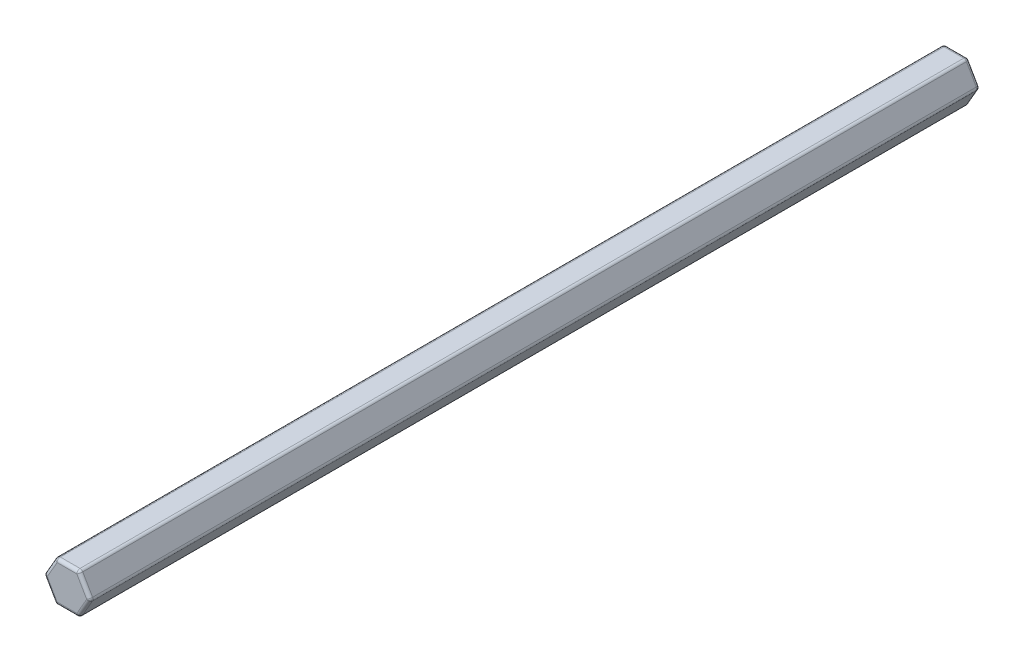
ISO-10303-21;
HEADER;
FILE_DESCRIPTION(('STEP AP214'),'2;1');
FILE_NAME('part.step','',(''),(''),'','','');
FILE_SCHEMA(('AUTOMOTIVE_DESIGN { 1 0 10303 214 1 1 1 1 }'));
ENDSEC;
DATA;
#1=APPLICATION_CONTEXT('core data for automotive mechanical design processes');
#2=APPLICATION_PROTOCOL_DEFINITION('international standard','automotive_design',2000,#1);
#3=PRODUCT_CONTEXT('',#1,'mechanical');
#4=PRODUCT('Part','Part','',(#3));
#5=PRODUCT_RELATED_PRODUCT_CATEGORY('part','',(#4));
#6=PRODUCT_DEFINITION_FORMATION('','',#4);
#7=PRODUCT_DEFINITION_CONTEXT('part definition',#1,'design');
#8=PRODUCT_DEFINITION('design','',#6,#7);
#9=PRODUCT_DEFINITION_SHAPE('','',#8);
#10=(LENGTH_UNIT() NAMED_UNIT(*) SI_UNIT(.MILLI.,.METRE.));
#11=(NAMED_UNIT(*) PLANE_ANGLE_UNIT() SI_UNIT($,.RADIAN.));
#12=(NAMED_UNIT(*) SI_UNIT($,.STERADIAN.) SOLID_ANGLE_UNIT());
#13=UNCERTAINTY_MEASURE_WITH_UNIT(LENGTH_MEASURE(1.E-05),#10,'distance_accuracy_value','');
#14=(GEOMETRIC_REPRESENTATION_CONTEXT(3) GLOBAL_UNCERTAINTY_ASSIGNED_CONTEXT((#13)) GLOBAL_UNIT_ASSIGNED_CONTEXT((#10,
#11,#12)) REPRESENTATION_CONTEXT('',''));
#15=CARTESIAN_POINT('',(0.,0.,0.));
#16=DIRECTION('',(0.,0.,1.));
#17=DIRECTION('',(1.,0.,0.));
#18=AXIS2_PLACEMENT_3D('',#15,#16,#17);
#19=CARTESIAN_POINT('',(3.66617420935412,-6.35,139.7));
#20=DIRECTION('',(-0.866025403784439,0.5,0.));
#21=DIRECTION('',(-0.5,-0.866025403784439,0.));
#22=AXIS2_PLACEMENT_3D('',#19,#20,#21);
#23=PLANE('',#22);
#24=DIRECTION('',(0.5,0.866025403784439,0.));
#25=VECTOR('',#24,1.);
#26=CARTESIAN_POINT('',(3.66617420935412,-6.35,138.7));
#27=LINE('',#26,#25);
#28=CARTESIAN_POINT('',(7.04367328411343,-0.5,138.7));
#29=VERTEX_POINT('',#28);
#30=CARTESIAN_POINT('',(3.95484934394893,-5.85,138.7));
#31=VERTEX_POINT('',#30);
#32=EDGE_CURVE('E281',#29,#31,#27,.F.);
#33=ORIENTED_EDGE('',*,*,#32,.T.);
#34=DIRECTION('',(0.,0.,-1.));
#35=VECTOR('',#34,1.);
#36=CARTESIAN_POINT('',(3.95484934394893,-5.85,139.7));
#37=LINE('',#36,#35);
#38=CARTESIAN_POINT('',(3.95484934394893,-5.85,-138.7));
#39=VERTEX_POINT('',#38);
#40=EDGE_CURVE('E288',#31,#39,#37,.T.);
#41=ORIENTED_EDGE('',*,*,#40,.T.);
#42=DIRECTION('',(0.5,0.866025403784439,0.));
#43=VECTOR('',#42,1.);
#44=CARTESIAN_POINT('',(3.66617420935412,-6.35,-138.7));
#45=LINE('',#44,#43);
#46=CARTESIAN_POINT('',(7.04367328411343,-0.5,-138.7));
#47=VERTEX_POINT('',#46);
#48=EDGE_CURVE('E284',#39,#47,#45,.T.);
#49=ORIENTED_EDGE('',*,*,#48,.T.);
#50=DIRECTION('',(0.,0.,-1.));
#51=VECTOR('',#50,1.);
#52=CARTESIAN_POINT('',(7.04367328411343,-0.500000000000001,139.7));
#53=LINE('',#52,#51);
#54=EDGE_CURVE('E278',#47,#29,#53,.F.);
#55=ORIENTED_EDGE('',*,*,#54,.T.);
#56=EDGE_LOOP('',(#33,#41,#49,#55));
#57=FACE_BOUND('',#56,.T.);
#58=ADVANCED_FACE('F39',(#57),#23,.F.);
#59=CARTESIAN_POINT('',(7.33234841870824,0.,139.7));
#60=DIRECTION('',(-0.866025403784439,-0.5,0.));
#61=DIRECTION('',(0.5,-0.866025403784439,0.));
#62=AXIS2_PLACEMENT_3D('',#59,#60,#61);
#63=PLANE('',#62);
#64=DIRECTION('',(-0.5,0.866025403784439,0.));
#65=VECTOR('',#64,1.);
#66=CARTESIAN_POINT('',(7.33234841870824,0.,138.7));
#67=LINE('',#66,#65);
#68=CARTESIAN_POINT('',(3.95484934394893,5.85,138.7));
#69=VERTEX_POINT('',#68);
#70=CARTESIAN_POINT('',(7.04367328411343,0.5,138.7));
#71=VERTEX_POINT('',#70);
#72=EDGE_CURVE('E196',#69,#71,#67,.F.);
#73=ORIENTED_EDGE('',*,*,#72,.T.);
#74=DIRECTION('',(0.,0.,-1.));
#75=VECTOR('',#74,1.);
#76=CARTESIAN_POINT('',(7.04367328411343,0.5,139.7));
#77=LINE('',#76,#75);
#78=CARTESIAN_POINT('',(7.04367328411343,0.5,-138.7));
#79=VERTEX_POINT('',#78);
#80=EDGE_CURVE('E200',#71,#79,#77,.T.);
#81=ORIENTED_EDGE('',*,*,#80,.T.);
#82=DIRECTION('',(-0.5,0.866025403784439,0.));
#83=VECTOR('',#82,1.);
#84=CARTESIAN_POINT('',(7.33234841870824,0.,-138.7));
#85=LINE('',#84,#83);
#86=CARTESIAN_POINT('',(3.95484934394893,5.85,-138.7));
#87=VERTEX_POINT('',#86);
#88=EDGE_CURVE('E169',#79,#87,#85,.T.);
#89=ORIENTED_EDGE('',*,*,#88,.T.);
#90=DIRECTION('',(0.,0.,-1.));
#91=VECTOR('',#90,1.);
#92=CARTESIAN_POINT('',(3.95484934394893,5.85,139.7));
#93=LINE('',#92,#91);
#94=EDGE_CURVE('E189',#87,#69,#93,.F.);
#95=ORIENTED_EDGE('',*,*,#94,.T.);
#96=EDGE_LOOP('',(#73,#81,#89,#95));
#97=FACE_BOUND('',#96,.T.);
#98=ADVANCED_FACE('F198',(#97),#63,.F.);
#99=CARTESIAN_POINT('',(3.66617420935412,6.35,139.7));
#100=DIRECTION('',(0.,-1.,0.));
#101=DIRECTION('',(1.,0.,0.));
#102=AXIS2_PLACEMENT_3D('',#99,#100,#101);
#103=PLANE('',#102);
#104=DIRECTION('',(-1.,0.,0.));
#105=VECTOR('',#104,1.);
#106=CARTESIAN_POINT('',(3.66617420935412,6.35,-138.7));
#107=LINE('',#106,#105);
#108=CARTESIAN_POINT('',(3.08882394016449,6.35,-138.7));
#109=VERTEX_POINT('',#108);
#110=CARTESIAN_POINT('',(-3.0888239401645,6.35,-138.7));
#111=VERTEX_POINT('',#110);
#112=EDGE_CURVE('E232',#109,#111,#107,.T.);
#113=ORIENTED_EDGE('',*,*,#112,.T.);
#114=DIRECTION('',(0.,0.,-1.));
#115=VECTOR('',#114,1.);
#116=CARTESIAN_POINT('',(-3.0888239401645,6.35,139.7));
#117=LINE('',#116,#115);
#118=CARTESIAN_POINT('',(-3.0888239401645,6.35,138.7));
#119=VERTEX_POINT('',#118);
#120=EDGE_CURVE('E236',#111,#119,#117,.F.);
#121=ORIENTED_EDGE('',*,*,#120,.T.);
#122=DIRECTION('',(-1.,0.,0.));
#123=VECTOR('',#122,1.);
#124=CARTESIAN_POINT('',(3.66617420935412,6.35,138.7));
#125=LINE('',#124,#123);
#126=CARTESIAN_POINT('',(3.08882394016449,6.35,138.7));
#127=VERTEX_POINT('',#126);
#128=EDGE_CURVE('E229',#119,#127,#125,.F.);
#129=ORIENTED_EDGE('',*,*,#128,.T.);
#130=DIRECTION('',(0.,0.,-1.));
#131=VECTOR('',#130,1.);
#132=CARTESIAN_POINT('',(3.08882394016449,6.35,139.7));
#133=LINE('',#132,#131);
#134=EDGE_CURVE('E226',#127,#109,#133,.T.);
#135=ORIENTED_EDGE('',*,*,#134,.T.);
#136=EDGE_LOOP('',(#113,#121,#129,#135));
#137=FACE_BOUND('',#136,.T.);
#138=ADVANCED_FACE('F487',(#137),#103,.F.);
#139=CARTESIAN_POINT('',(-3.66617420935412,6.35,139.7));
#140=DIRECTION('',(0.866025403784439,-0.5,0.));
#141=DIRECTION('',(0.5,0.866025403784439,0.));
#142=AXIS2_PLACEMENT_3D('',#139,#140,#141);
#143=PLANE('',#142);
#144=DIRECTION('',(-0.5,-0.866025403784439,0.));
#145=VECTOR('',#144,1.);
#146=CARTESIAN_POINT('',(-3.66617420935412,6.35,-138.7));
#147=LINE('',#146,#145);
#148=CARTESIAN_POINT('',(-3.95484934394893,5.85,-138.7));
#149=VERTEX_POINT('',#148);
#150=CARTESIAN_POINT('',(-7.04367328411343,0.500000000000001,-138.7));
#151=VERTEX_POINT('',#150);
#152=EDGE_CURVE('E245',#149,#151,#147,.T.);
#153=ORIENTED_EDGE('',*,*,#152,.T.);
#154=DIRECTION('',(0.,0.,-1.));
#155=VECTOR('',#154,1.);
#156=CARTESIAN_POINT('',(-7.04367328411343,0.500000000000002,139.7));
#157=LINE('',#156,#155);
#158=CARTESIAN_POINT('',(-7.04367328411343,0.500000000000001,138.7));
#159=VERTEX_POINT('',#158);
#160=EDGE_CURVE('E249',#151,#159,#157,.F.);
#161=ORIENTED_EDGE('',*,*,#160,.T.);
#162=DIRECTION('',(-0.5,-0.866025403784439,0.));
#163=VECTOR('',#162,1.);
#164=CARTESIAN_POINT('',(-3.66617420935412,6.35,138.7));
#165=LINE('',#164,#163);
#166=CARTESIAN_POINT('',(-3.95484934394893,5.85,138.7));
#167=VERTEX_POINT('',#166);
#168=EDGE_CURVE('E242',#159,#167,#165,.F.);
#169=ORIENTED_EDGE('',*,*,#168,.T.);
#170=DIRECTION('',(0.,0.,-1.));
#171=VECTOR('',#170,1.);
#172=CARTESIAN_POINT('',(-3.95484934394893,5.85,139.7));
#173=LINE('',#172,#171);
#174=EDGE_CURVE('E239',#167,#149,#173,.T.);
#175=ORIENTED_EDGE('',*,*,#174,.T.);
#176=EDGE_LOOP('',(#153,#161,#169,#175));
#177=FACE_BOUND('',#176,.T.);
#178=ADVANCED_FACE('F775',(#177),#143,.F.);
#179=CARTESIAN_POINT('',(-7.33234841870825,0.,139.7));
#180=DIRECTION('',(0.866025403784439,0.5,0.));
#181=DIRECTION('',(-0.5,0.866025403784439,0.));
#182=AXIS2_PLACEMENT_3D('',#179,#180,#181);
#183=PLANE('',#182);
#184=DIRECTION('',(0.5,-0.866025403784439,0.));
#185=VECTOR('',#184,1.);
#186=CARTESIAN_POINT('',(-7.33234841870825,0.,-138.7));
#187=LINE('',#186,#185);
#188=CARTESIAN_POINT('',(-7.04367328411343,-0.499999999999999,-138.7));
#189=VERTEX_POINT('',#188);
#190=CARTESIAN_POINT('',(-3.95484934394894,-5.85,-138.7));
#191=VERTEX_POINT('',#190);
#192=EDGE_CURVE('E258',#189,#191,#187,.T.);
#193=ORIENTED_EDGE('',*,*,#192,.T.);
#194=DIRECTION('',(0.,0.,-1.));
#195=VECTOR('',#194,1.);
#196=CARTESIAN_POINT('',(-3.95484934394894,-5.85,139.7));
#197=LINE('',#196,#195);
#198=CARTESIAN_POINT('',(-3.95484934394894,-5.85,138.7));
#199=VERTEX_POINT('',#198);
#200=EDGE_CURVE('E262',#191,#199,#197,.F.);
#201=ORIENTED_EDGE('',*,*,#200,.T.);
#202=DIRECTION('',(0.5,-0.866025403784439,0.));
#203=VECTOR('',#202,1.);
#204=CARTESIAN_POINT('',(-7.33234841870825,0.,138.7));
#205=LINE('',#204,#203);
#206=CARTESIAN_POINT('',(-7.04367328411343,-0.499999999999999,138.7));
#207=VERTEX_POINT('',#206);
#208=EDGE_CURVE('E255',#199,#207,#205,.F.);
#209=ORIENTED_EDGE('',*,*,#208,.T.);
#210=DIRECTION('',(0.,0.,-1.));
#211=VECTOR('',#210,1.);
#212=CARTESIAN_POINT('',(-7.04367328411343,-0.499999999999999,139.7));
#213=LINE('',#212,#211);
#214=EDGE_CURVE('E252',#207,#189,#213,.T.);
#215=ORIENTED_EDGE('',*,*,#214,.T.);
#216=EDGE_LOOP('',(#193,#201,#209,#215));
#217=FACE_BOUND('',#216,.T.);
#218=ADVANCED_FACE('F767',(#217),#183,.F.);
#219=CARTESIAN_POINT('',(-3.66617420935412,-6.35,139.7));
#220=DIRECTION('',(0.,1.,0.));
#221=DIRECTION('',(-1.,0.,0.));
#222=AXIS2_PLACEMENT_3D('',#219,#220,#221);
#223=PLANE('',#222);
#224=DIRECTION('',(1.,0.,0.));
#225=VECTOR('',#224,1.);
#226=CARTESIAN_POINT('',(-3.66617420935412,-6.35,-138.7));
#227=LINE('',#226,#225);
#228=CARTESIAN_POINT('',(-3.0888239401645,-6.35,-138.7));
#229=VERTEX_POINT('',#228);
#230=CARTESIAN_POINT('',(3.08882394016449,-6.35,-138.7));
#231=VERTEX_POINT('',#230);
#232=EDGE_CURVE('E271',#229,#231,#227,.T.);
#233=ORIENTED_EDGE('',*,*,#232,.T.);
#234=DIRECTION('',(0.,0.,-1.));
#235=VECTOR('',#234,1.);
#236=CARTESIAN_POINT('',(3.08882394016449,-6.35,139.7));
#237=LINE('',#236,#235);
#238=CARTESIAN_POINT('',(3.08882394016449,-6.35,138.7));
#239=VERTEX_POINT('',#238);
#240=EDGE_CURVE('E275',#231,#239,#237,.F.);
#241=ORIENTED_EDGE('',*,*,#240,.T.);
#242=DIRECTION('',(1.,0.,0.));
#243=VECTOR('',#242,1.);
#244=CARTESIAN_POINT('',(-3.66617420935412,-6.35,138.7));
#245=LINE('',#244,#243);
#246=CARTESIAN_POINT('',(-3.0888239401645,-6.35,138.7));
#247=VERTEX_POINT('',#246);
#248=EDGE_CURVE('E268',#239,#247,#245,.F.);
#249=ORIENTED_EDGE('',*,*,#248,.T.);
#250=DIRECTION('',(0.,0.,-1.));
#251=VECTOR('',#250,1.);
#252=CARTESIAN_POINT('',(-3.0888239401645,-6.35,139.7));
#253=LINE('',#252,#251);
#254=EDGE_CURVE('E265',#247,#229,#253,.T.);
#255=ORIENTED_EDGE('',*,*,#254,.T.);
#256=EDGE_LOOP('',(#233,#241,#249,#255));
#257=FACE_BOUND('',#256,.T.);
#258=ADVANCED_FACE('F442',(#257),#223,.F.);
#259=CARTESIAN_POINT('',(0.,0.,139.7));
#260=DIRECTION('',(0.,0.,1.));
#261=DIRECTION('',(1.,0.,0.));
#262=AXIS2_PLACEMENT_3D('',#259,#260,#261);
#263=PLANE('',#262);
#264=DIRECTION('',(0.5,-0.866025403784439,0.));
#265=VECTOR('',#264,1.);
#266=CARTESIAN_POINT('',(-2.80014880556968,-5.85,139.7));
#267=LINE('',#266,#265);
#268=CARTESIAN_POINT('',(-6.17764788032899,0.,139.7));
#269=VERTEX_POINT('',#268);
#270=CARTESIAN_POINT('',(-3.0888239401645,-5.35,139.7));
#271=VERTEX_POINT('',#270);
#272=EDGE_CURVE('E49',#269,#271,#267,.T.);
#273=ORIENTED_EDGE('',*,*,#272,.T.);
#274=DIRECTION('',(1.,0.,0.));
#275=VECTOR('',#274,1.);
#276=CARTESIAN_POINT('',(3.66617420935412,-5.35,139.7));
#277=LINE('',#276,#275);
#278=CARTESIAN_POINT('',(3.08882394016449,-5.35,139.7));
#279=VERTEX_POINT('',#278);
#280=EDGE_CURVE('E11',#271,#279,#277,.T.);
#281=ORIENTED_EDGE('',*,*,#280,.T.);
#282=DIRECTION('',(0.5,0.866025403784439,0.));
#283=VECTOR('',#282,1.);
#284=CARTESIAN_POINT('',(6.4663230149238,0.5,139.7));
#285=LINE('',#284,#283);
#286=CARTESIAN_POINT('',(6.17764788032899,0.,139.7));
#287=VERTEX_POINT('',#286);
#288=EDGE_CURVE('E291',#279,#287,#285,.T.);
#289=ORIENTED_EDGE('',*,*,#288,.T.);
#290=DIRECTION('',(-0.5,0.866025403784439,0.));
#291=VECTOR('',#290,1.);
#292=CARTESIAN_POINT('',(2.80014880556968,5.85,139.7));
#293=LINE('',#292,#291);
#294=CARTESIAN_POINT('',(3.08882394016449,5.35,139.7));
#295=VERTEX_POINT('',#294);
#296=EDGE_CURVE('E294',#287,#295,#293,.T.);
#297=ORIENTED_EDGE('',*,*,#296,.T.);
#298=DIRECTION('',(-1.,0.,0.));
#299=VECTOR('',#298,1.);
#300=CARTESIAN_POINT('',(-3.66617420935412,5.35,139.7));
#301=LINE('',#300,#299);
#302=CARTESIAN_POINT('',(-3.08882394016449,5.35,139.7));
#303=VERTEX_POINT('',#302);
#304=EDGE_CURVE('E297',#295,#303,#301,.T.);
#305=ORIENTED_EDGE('',*,*,#304,.T.);
#306=DIRECTION('',(-0.5,-0.866025403784439,0.));
#307=VECTOR('',#306,1.);
#308=CARTESIAN_POINT('',(-6.46632301492381,-0.499999999999999,139.7));
#309=LINE('',#308,#307);
#310=EDGE_CURVE('E60',#303,#269,#309,.T.);
#311=ORIENTED_EDGE('',*,*,#310,.T.);
#312=EDGE_LOOP('',(#273,#281,#289,#297,#305,#311));
#313=FACE_BOUND('',#312,.T.);
#314=ADVANCED_FACE('F449',(#313),#263,.T.);
#315=CARTESIAN_POINT('',(0.,0.,-139.7));
#316=DIRECTION('',(0.,0.,1.));
#317=DIRECTION('',(1.,0.,0.));
#318=AXIS2_PLACEMENT_3D('',#315,#316,#317);
#319=PLANE('',#318);
#320=DIRECTION('',(-1.,0.,0.));
#321=VECTOR('',#320,1.);
#322=CARTESIAN_POINT('',(0.,5.35,-139.7));
#323=LINE('',#322,#321);
#324=CARTESIAN_POINT('',(-3.0888239401645,5.35,-139.7));
#325=VERTEX_POINT('',#324);
#326=CARTESIAN_POINT('',(3.08882394016449,5.35,-139.7));
#327=VERTEX_POINT('',#326);
#328=EDGE_CURVE('E221',#325,#327,#323,.F.);
#329=ORIENTED_EDGE('',*,*,#328,.T.);
#330=DIRECTION('',(-0.5,0.866025403784439,0.));
#331=VECTOR('',#330,1.);
#332=CARTESIAN_POINT('',(4.63323591024674,2.675,-139.7));
#333=LINE('',#332,#331);
#334=CARTESIAN_POINT('',(6.17764788032899,0.,-139.7));
#335=VERTEX_POINT('',#334);
#336=EDGE_CURVE('E171',#327,#335,#333,.F.);
#337=ORIENTED_EDGE('',*,*,#336,.T.);
#338=DIRECTION('',(0.5,0.866025403784439,0.));
#339=VECTOR('',#338,1.);
#340=CARTESIAN_POINT('',(4.63323591024674,-2.675,-139.7));
#341=LINE('',#340,#339);
#342=CARTESIAN_POINT('',(3.08882394016449,-5.35,-139.7));
#343=VERTEX_POINT('',#342);
#344=EDGE_CURVE('E206',#335,#343,#341,.F.);
#345=ORIENTED_EDGE('',*,*,#344,.T.);
#346=DIRECTION('',(1.,0.,0.));
#347=VECTOR('',#346,1.);
#348=CARTESIAN_POINT('',(0.,-5.35,-139.7));
#349=LINE('',#348,#347);
#350=CARTESIAN_POINT('',(-3.0888239401645,-5.35,-139.7));
#351=VERTEX_POINT('',#350);
#352=EDGE_CURVE('E212',#343,#351,#349,.F.);
#353=ORIENTED_EDGE('',*,*,#352,.T.);
#354=DIRECTION('',(0.5,-0.866025403784439,0.));
#355=VECTOR('',#354,1.);
#356=CARTESIAN_POINT('',(-4.63323591024675,-2.675,-139.7));
#357=LINE('',#356,#355);
#358=CARTESIAN_POINT('',(-6.17764788032899,0.,-139.7));
#359=VERTEX_POINT('',#358);
#360=EDGE_CURVE('E215',#351,#359,#357,.F.);
#361=ORIENTED_EDGE('',*,*,#360,.T.);
#362=DIRECTION('',(-0.5,-0.866025403784439,0.));
#363=VECTOR('',#362,1.);
#364=CARTESIAN_POINT('',(-4.63323591024675,2.675,-139.7));
#365=LINE('',#364,#363);
#366=EDGE_CURVE('E218',#359,#325,#365,.F.);
#367=ORIENTED_EDGE('',*,*,#366,.T.);
#368=EDGE_LOOP('',(#329,#337,#345,#353,#361,#367));
#369=FACE_BOUND('',#368,.T.);
#370=ADVANCED_FACE('F478',(#369),#319,.F.);
#371=CARTESIAN_POINT('',(-4.63323591024675,-2.675,138.7));
#372=DIRECTION('',(-0.5,0.866025403784439,0.));
#373=DIRECTION('',(-0.866025403784439,-0.5,0.));
#374=AXIS2_PLACEMENT_3D('',#371,#372,#373);
#375=CYLINDRICAL_SURFACE('',#374,1.);
#376=CARTESIAN_POINT('',(-3.0888239401645,-5.35,138.7));
#377=DIRECTION('',(0.5,-0.866025403784439,0.));
#378=DIRECTION('',(0.866025403784439,0.5,0.));
#379=AXIS2_PLACEMENT_3D('',#376,#377,#378);
#380=CIRCLE('',#379,1.);
#381=EDGE_CURVE('E43',#271,#199,#380,.T.);
#382=ORIENTED_EDGE('',*,*,#381,.F.);
#383=ORIENTED_EDGE('',*,*,#272,.F.);
#384=CARTESIAN_POINT('',(-6.17764788032899,0.,138.7));
#385=DIRECTION('',(-0.5,0.866025403784439,0.));
#386=DIRECTION('',(-0.866025403784439,-0.5,0.));
#387=AXIS2_PLACEMENT_3D('',#384,#385,#386);
#388=CIRCLE('',#387,1.);
#389=EDGE_CURVE('E419',#207,#269,#388,.T.);
#390=ORIENTED_EDGE('',*,*,#389,.F.);
#391=ORIENTED_EDGE('',*,*,#208,.F.);
#392=EDGE_LOOP('',(#382,#383,#390,#391));
#393=FACE_BOUND('',#392,.T.);
#394=ADVANCED_FACE('F41',(#393),#375,.T.);
#395=CARTESIAN_POINT('',(-3.0888239401645,-5.35,138.7));
#396=DIRECTION('',(0.,0.,1.));
#397=DIRECTION('',(1.,0.,0.));
#398=AXIS2_PLACEMENT_3D('',#395,#396,#397);
#399=SPHERICAL_SURFACE('',#398,1.);
#400=CARTESIAN_POINT('',(-3.0888239401645,-5.35,138.7));
#401=DIRECTION('',(-1.,0.,0.));
#402=DIRECTION('',(0.,-1.,0.));
#403=AXIS2_PLACEMENT_3D('',#400,#401,#402);
#404=CIRCLE('',#403,1.);
#405=EDGE_CURVE('E412',#271,#247,#404,.F.);
#406=ORIENTED_EDGE('',*,*,#405,.F.);
#407=ORIENTED_EDGE('',*,*,#381,.T.);
#408=CARTESIAN_POINT('',(-3.0888239401645,-5.35,138.7));
#409=DIRECTION('',(0.,0.,1.));
#410=DIRECTION('',(1.,0.,0.));
#411=AXIS2_PLACEMENT_3D('',#408,#409,#410);
#412=CIRCLE('',#411,1.);
#413=EDGE_CURVE('E416',#247,#199,#412,.F.);
#414=ORIENTED_EDGE('',*,*,#413,.F.);
#415=EDGE_LOOP('',(#406,#407,#414));
#416=FACE_BOUND('',#415,.T.);
#417=ADVANCED_FACE('F431',(#416),#399,.T.);
#418=CARTESIAN_POINT('',(-6.17764788032899,0.,138.7));
#419=DIRECTION('',(0.,0.,1.));
#420=DIRECTION('',(0.,-1.,0.));
#421=AXIS2_PLACEMENT_3D('',#418,#419,#420);
#422=SPHERICAL_SURFACE('',#421,1.);
#423=CARTESIAN_POINT('',(-6.17764788032899,0.,138.7));
#424=DIRECTION('',(0.,0.,1.));
#425=DIRECTION('',(1.,0.,0.));
#426=AXIS2_PLACEMENT_3D('',#423,#424,#425);
#427=CIRCLE('',#426,1.);
#428=EDGE_CURVE('E404',#207,#159,#427,.F.);
#429=ORIENTED_EDGE('',*,*,#428,.F.);
#430=ORIENTED_EDGE('',*,*,#389,.T.);
#431=CARTESIAN_POINT('',(-6.17764788032899,0.,138.7));
#432=DIRECTION('',(-0.500000000000001,-0.866025403784438,0.));
#433=DIRECTION('',(0.866025403784438,-0.500000000000001,0.));
#434=AXIS2_PLACEMENT_3D('',#431,#432,#433);
#435=CIRCLE('',#434,1.);
#436=EDGE_CURVE('E408',#159,#269,#435,.F.);
#437=ORIENTED_EDGE('',*,*,#436,.F.);
#438=EDGE_LOOP('',(#429,#430,#437));
#439=FACE_BOUND('',#438,.T.);
#440=ADVANCED_FACE('F726',(#439),#422,.T.);
#441=CARTESIAN_POINT('',(-3.0888239401645,-5.35,139.7));
#442=DIRECTION('',(0.,0.,-1.));
#443=DIRECTION('',(-1.,0.,0.));
#444=AXIS2_PLACEMENT_3D('',#441,#442,#443);
#445=CYLINDRICAL_SURFACE('',#444,1.);
#446=ORIENTED_EDGE('',*,*,#413,.T.);
#447=ORIENTED_EDGE('',*,*,#200,.F.);
#448=CARTESIAN_POINT('',(-3.0888239401645,-5.35,-138.7));
#449=DIRECTION('',(0.,0.,-1.));
#450=DIRECTION('',(-1.,0.,0.));
#451=AXIS2_PLACEMENT_3D('',#448,#449,#450);
#452=CIRCLE('',#451,1.);
#453=EDGE_CURVE('E397',#229,#191,#452,.T.);
#454=ORIENTED_EDGE('',*,*,#453,.F.);
#455=ORIENTED_EDGE('',*,*,#254,.F.);
#456=EDGE_LOOP('',(#446,#447,#454,#455));
#457=FACE_BOUND('',#456,.T.);
#458=ADVANCED_FACE('F438',(#457),#445,.T.);
#459=CARTESIAN_POINT('',(0.,-5.35,138.7));
#460=DIRECTION('',(-1.,0.,0.));
#461=DIRECTION('',(0.,-1.,0.));
#462=AXIS2_PLACEMENT_3D('',#459,#460,#461);
#463=CYLINDRICAL_SURFACE('',#462,1.);
#464=ORIENTED_EDGE('',*,*,#405,.T.);
#465=ORIENTED_EDGE('',*,*,#248,.F.);
#466=CARTESIAN_POINT('',(3.08882394016449,-5.35,138.7));
#467=DIRECTION('',(1.,0.,0.));
#468=DIRECTION('',(0.,1.,0.));
#469=AXIS2_PLACEMENT_3D('',#466,#467,#468);
#470=CIRCLE('',#469,1.);
#471=EDGE_CURVE('E393',#279,#239,#470,.T.);
#472=ORIENTED_EDGE('',*,*,#471,.F.);
#473=ORIENTED_EDGE('',*,*,#280,.F.);
#474=EDGE_LOOP('',(#464,#465,#472,#473));
#475=FACE_BOUND('',#474,.T.);
#476=ADVANCED_FACE('F448',(#475),#463,.T.);
#477=CARTESIAN_POINT('',(-4.63323591024675,2.675,138.7));
#478=DIRECTION('',(0.5,0.866025403784439,0.));
#479=DIRECTION('',(-0.866025403784439,0.5,0.));
#480=AXIS2_PLACEMENT_3D('',#477,#478,#479);
#481=CYLINDRICAL_SURFACE('',#480,1.);
#482=ORIENTED_EDGE('',*,*,#436,.T.);
#483=ORIENTED_EDGE('',*,*,#310,.F.);
#484=CARTESIAN_POINT('',(-3.0888239401645,5.35,138.7));
#485=DIRECTION('',(0.500000000000001,0.866025403784438,0.));
#486=DIRECTION('',(-0.866025403784438,0.500000000000001,0.));
#487=AXIS2_PLACEMENT_3D('',#484,#485,#486);
#488=CIRCLE('',#487,1.);
#489=EDGE_CURVE('E389',#167,#303,#488,.T.);
#490=ORIENTED_EDGE('',*,*,#489,.F.);
#491=ORIENTED_EDGE('',*,*,#168,.F.);
#492=EDGE_LOOP('',(#482,#483,#490,#491));
#493=FACE_BOUND('',#492,.T.);
#494=ADVANCED_FACE('F702',(#493),#481,.T.);
#495=CARTESIAN_POINT('',(-6.17764788032899,0.,139.7));
#496=DIRECTION('',(0.,0.,-1.));
#497=DIRECTION('',(-1.,0.,0.));
#498=AXIS2_PLACEMENT_3D('',#495,#496,#497);
#499=CYLINDRICAL_SURFACE('',#498,1.);
#500=ORIENTED_EDGE('',*,*,#428,.T.);
#501=ORIENTED_EDGE('',*,*,#160,.F.);
#502=CARTESIAN_POINT('',(-6.17764788032899,0.,-138.7));
#503=DIRECTION('',(0.,0.,-1.));
#504=DIRECTION('',(-1.,0.,0.));
#505=AXIS2_PLACEMENT_3D('',#502,#503,#504);
#506=CIRCLE('',#505,1.);
#507=EDGE_CURVE('E385',#189,#151,#506,.T.);
#508=ORIENTED_EDGE('',*,*,#507,.F.);
#509=ORIENTED_EDGE('',*,*,#214,.F.);
#510=EDGE_LOOP('',(#500,#501,#508,#509));
#511=FACE_BOUND('',#510,.T.);
#512=ADVANCED_FACE('F693',(#511),#499,.T.);
#513=CARTESIAN_POINT('',(-6.46632301492381,0.500000000000002,-138.7));
#514=DIRECTION('',(0.5,-0.866025403784439,0.));
#515=DIRECTION('',(0.866025403784439,0.5,0.));
#516=AXIS2_PLACEMENT_3D('',#513,#514,#515);
#517=CYLINDRICAL_SURFACE('',#516,1.);
#518=CARTESIAN_POINT('',(-3.0888239401645,-5.35,-138.7));
#519=DIRECTION('',(0.5,-0.866025403784439,0.));
#520=DIRECTION('',(0.866025403784439,0.5,0.));
#521=AXIS2_PLACEMENT_3D('',#518,#519,#520);
#522=CIRCLE('',#521,1.);
#523=EDGE_CURVE('E400',#191,#351,#522,.T.);
#524=ORIENTED_EDGE('',*,*,#523,.F.);
#525=ORIENTED_EDGE('',*,*,#192,.F.);
#526=CARTESIAN_POINT('',(-6.17764788032899,0.,-138.7));
#527=DIRECTION('',(-0.5,0.866025403784438,0.));
#528=DIRECTION('',(-0.866025403784439,-0.5,0.));
#529=AXIS2_PLACEMENT_3D('',#526,#527,#528);
#530=CIRCLE('',#529,1.);
#531=EDGE_CURVE('E381',#359,#189,#530,.T.);
#532=ORIENTED_EDGE('',*,*,#531,.F.);
#533=ORIENTED_EDGE('',*,*,#360,.F.);
#534=EDGE_LOOP('',(#524,#525,#532,#533));
#535=FACE_BOUND('',#534,.T.);
#536=ADVANCED_FACE('F684',(#535),#517,.T.);
#537=CARTESIAN_POINT('',(-3.0888239401645,-5.35,-138.7));
#538=DIRECTION('',(0.,0.,-1.));
#539=DIRECTION('',(-1.,0.,0.));
#540=AXIS2_PLACEMENT_3D('',#537,#538,#539);
#541=SPHERICAL_SURFACE('',#540,1.);
#542=ORIENTED_EDGE('',*,*,#453,.T.);
#543=ORIENTED_EDGE('',*,*,#523,.T.);
#544=CARTESIAN_POINT('',(-3.0888239401645,-5.35,-138.7));
#545=DIRECTION('',(-1.,0.,0.));
#546=DIRECTION('',(0.,0.,1.));
#547=AXIS2_PLACEMENT_3D('',#544,#545,#546);
#548=CIRCLE('',#547,1.);
#549=EDGE_CURVE('E377',#229,#351,#548,.F.);
#550=ORIENTED_EDGE('',*,*,#549,.F.);
#551=EDGE_LOOP('',(#542,#543,#550));
#552=FACE_BOUND('',#551,.T.);
#553=ADVANCED_FACE('F675',(#552),#541,.T.);
#554=CARTESIAN_POINT('',(3.08882394016449,-5.35,138.7));
#555=DIRECTION('',(0.,0.,1.));
#556=DIRECTION('',(1.,0.,0.));
#557=AXIS2_PLACEMENT_3D('',#554,#555,#556);
#558=SPHERICAL_SURFACE('',#557,1.);
#559=CARTESIAN_POINT('',(3.08882394016449,-5.35,138.7));
#560=DIRECTION('',(-0.5,-0.866025403784439,0.));
#561=DIRECTION('',(0.866025403784439,-0.5,0.));
#562=AXIS2_PLACEMENT_3D('',#559,#560,#561);
#563=CIRCLE('',#562,1.);
#564=EDGE_CURVE('E369',#279,#31,#563,.F.);
#565=ORIENTED_EDGE('',*,*,#564,.F.);
#566=ORIENTED_EDGE('',*,*,#471,.T.);
#567=CARTESIAN_POINT('',(3.08882394016449,-5.35,138.7));
#568=DIRECTION('',(0.,0.,1.));
#569=DIRECTION('',(1.,0.,0.));
#570=AXIS2_PLACEMENT_3D('',#567,#568,#569);
#571=CIRCLE('',#570,1.);
#572=EDGE_CURVE('E373',#31,#239,#571,.F.);
#573=ORIENTED_EDGE('',*,*,#572,.F.);
#574=EDGE_LOOP('',(#565,#566,#573));
#575=FACE_BOUND('',#574,.T.);
#576=ADVANCED_FACE('F666',(#575),#558,.T.);
#577=CARTESIAN_POINT('',(-3.0888239401645,5.35,138.7));
#578=DIRECTION('',(0.,0.,1.));
#579=DIRECTION('',(1.,0.,0.));
#580=AXIS2_PLACEMENT_3D('',#577,#578,#579);
#581=SPHERICAL_SURFACE('',#580,1.);
#582=CARTESIAN_POINT('',(-3.0888239401645,5.35,138.7));
#583=DIRECTION('',(0.,0.,1.));
#584=DIRECTION('',(1.,0.,0.));
#585=AXIS2_PLACEMENT_3D('',#582,#583,#584);
#586=CIRCLE('',#585,1.);
#587=EDGE_CURVE('E361',#167,#119,#586,.F.);
#588=ORIENTED_EDGE('',*,*,#587,.F.);
#589=ORIENTED_EDGE('',*,*,#489,.T.);
#590=CARTESIAN_POINT('',(-3.08882394016449,5.35,138.7));
#591=DIRECTION('',(-1.,0.,0.));
#592=DIRECTION('',(0.,-1.,0.));
#593=AXIS2_PLACEMENT_3D('',#590,#591,#592);
#594=CIRCLE('',#593,1.);
#595=EDGE_CURVE('E365',#119,#303,#594,.F.);
#596=ORIENTED_EDGE('',*,*,#595,.F.);
#597=EDGE_LOOP('',(#588,#589,#596));
#598=FACE_BOUND('',#597,.T.);
#599=ADVANCED_FACE('F657',(#598),#581,.T.);
#600=CARTESIAN_POINT('',(-6.17764788032899,0.,-138.7));
#601=DIRECTION('',(0.,0.,-1.));
#602=DIRECTION('',(0.,1.,0.));
#603=AXIS2_PLACEMENT_3D('',#600,#601,#602);
#604=SPHERICAL_SURFACE('',#603,1.);
#605=ORIENTED_EDGE('',*,*,#531,.T.);
#606=ORIENTED_EDGE('',*,*,#507,.T.);
#607=CARTESIAN_POINT('',(-6.17764788032899,0.,-138.7));
#608=DIRECTION('',(-0.5,-0.866025403784438,0.));
#609=DIRECTION('',(0.866025403784439,-0.5,0.));
#610=AXIS2_PLACEMENT_3D('',#607,#608,#609);
#611=CIRCLE('',#610,1.);
#612=EDGE_CURVE('E358',#359,#151,#611,.F.);
#613=ORIENTED_EDGE('',*,*,#612,.F.);
#614=EDGE_LOOP('',(#605,#606,#613));
#615=FACE_BOUND('',#614,.T.);
#616=ADVANCED_FACE('F648',(#615),#604,.T.);
#617=CARTESIAN_POINT('',(-3.66617420935412,-5.35,-138.7));
#618=DIRECTION('',(1.,0.,0.));
#619=DIRECTION('',(0.,1.,0.));
#620=AXIS2_PLACEMENT_3D('',#617,#618,#619);
#621=CYLINDRICAL_SURFACE('',#620,1.);
#622=ORIENTED_EDGE('',*,*,#549,.T.);
#623=ORIENTED_EDGE('',*,*,#352,.F.);
#624=CARTESIAN_POINT('',(3.08882394016449,-5.35,-138.7));
#625=DIRECTION('',(1.,0.,0.));
#626=DIRECTION('',(0.,1.,0.));
#627=AXIS2_PLACEMENT_3D('',#624,#625,#626);
#628=CIRCLE('',#627,1.);
#629=EDGE_CURVE('E354',#231,#343,#628,.T.);
#630=ORIENTED_EDGE('',*,*,#629,.F.);
#631=ORIENTED_EDGE('',*,*,#232,.F.);
#632=EDGE_LOOP('',(#622,#623,#630,#631));
#633=FACE_BOUND('',#632,.T.);
#634=ADVANCED_FACE('F639',(#633),#621,.T.);
#635=CARTESIAN_POINT('',(3.08882394016449,-5.35,139.7));
#636=DIRECTION('',(0.,0.,-1.));
#637=DIRECTION('',(-1.,0.,0.));
#638=AXIS2_PLACEMENT_3D('',#635,#636,#637);
#639=CYLINDRICAL_SURFACE('',#638,1.);
#640=ORIENTED_EDGE('',*,*,#572,.T.);
#641=ORIENTED_EDGE('',*,*,#240,.F.);
#642=CARTESIAN_POINT('',(3.08882394016449,-5.35,-138.7));
#643=DIRECTION('',(0.,0.,-1.));
#644=DIRECTION('',(-1.,0.,0.));
#645=AXIS2_PLACEMENT_3D('',#642,#643,#644);
#646=CIRCLE('',#645,1.);
#647=EDGE_CURVE('E351',#39,#231,#646,.T.);
#648=ORIENTED_EDGE('',*,*,#647,.F.);
#649=ORIENTED_EDGE('',*,*,#40,.F.);
#650=EDGE_LOOP('',(#640,#641,#648,#649));
#651=FACE_BOUND('',#650,.T.);
#652=ADVANCED_FACE('F631',(#651),#639,.T.);
#653=CARTESIAN_POINT('',(4.63323591024674,-2.675,138.7));
#654=DIRECTION('',(-0.5,-0.866025403784439,0.));
#655=DIRECTION('',(0.866025403784439,-0.5,0.));
#656=AXIS2_PLACEMENT_3D('',#653,#654,#655);
#657=CYLINDRICAL_SURFACE('',#656,1.);
#658=ORIENTED_EDGE('',*,*,#564,.T.);
#659=ORIENTED_EDGE('',*,*,#32,.F.);
#660=CARTESIAN_POINT('',(6.17764788032899,0.,138.7));
#661=DIRECTION('',(0.499999999999999,0.866025403784439,0.));
#662=DIRECTION('',(-0.866025403784439,0.5,0.));
#663=AXIS2_PLACEMENT_3D('',#660,#661,#662);
#664=CIRCLE('',#663,1.);
#665=EDGE_CURVE('E347',#287,#29,#664,.T.);
#666=ORIENTED_EDGE('',*,*,#665,.F.);
#667=ORIENTED_EDGE('',*,*,#288,.F.);
#668=EDGE_LOOP('',(#658,#659,#666,#667));
#669=FACE_BOUND('',#668,.T.);
#670=ADVANCED_FACE('F461',(#669),#657,.T.);
#671=CARTESIAN_POINT('',(4.63323591024674,2.675,138.7));
#672=DIRECTION('',(0.5,-0.866025403784439,0.));
#673=DIRECTION('',(0.866025403784439,0.5,0.));
#674=AXIS2_PLACEMENT_3D('',#671,#672,#673);
#675=CYLINDRICAL_SURFACE('',#674,1.);
#676=CARTESIAN_POINT('',(3.08882394016449,5.35,138.7));
#677=DIRECTION('',(-0.5,0.866025403784439,0.));
#678=DIRECTION('',(-0.866025403784439,-0.5,0.));
#679=AXIS2_PLACEMENT_3D('',#676,#677,#678);
#680=CIRCLE('',#679,1.);
#681=EDGE_CURVE('E339',#295,#69,#680,.T.);
#682=ORIENTED_EDGE('',*,*,#681,.F.);
#683=ORIENTED_EDGE('',*,*,#296,.F.);
#684=CARTESIAN_POINT('',(6.17764788032899,0.,138.7));
#685=DIRECTION('',(0.5,-0.866025403784439,0.));
#686=DIRECTION('',(0.866025403784439,0.5,0.));
#687=AXIS2_PLACEMENT_3D('',#684,#685,#686);
#688=CIRCLE('',#687,1.);
#689=EDGE_CURVE('E343',#71,#287,#688,.T.);
#690=ORIENTED_EDGE('',*,*,#689,.F.);
#691=ORIENTED_EDGE('',*,*,#72,.F.);
#692=EDGE_LOOP('',(#682,#683,#690,#691));
#693=FACE_BOUND('',#692,.T.);
#694=ADVANCED_FACE('F458',(#693),#675,.T.);
#695=CARTESIAN_POINT('',(0.,5.35,138.7));
#696=DIRECTION('',(1.,0.,0.));
#697=DIRECTION('',(0.,1.,0.));
#698=AXIS2_PLACEMENT_3D('',#695,#696,#697);
#699=CYLINDRICAL_SURFACE('',#698,1.);
#700=ORIENTED_EDGE('',*,*,#595,.T.);
#701=ORIENTED_EDGE('',*,*,#304,.F.);
#702=CARTESIAN_POINT('',(3.08882394016449,5.35,138.7));
#703=DIRECTION('',(1.,0.,0.));
#704=DIRECTION('',(0.,1.,0.));
#705=AXIS2_PLACEMENT_3D('',#702,#703,#704);
#706=CIRCLE('',#705,1.);
#707=EDGE_CURVE('E335',#127,#295,#706,.T.);
#708=ORIENTED_EDGE('',*,*,#707,.F.);
#709=ORIENTED_EDGE('',*,*,#128,.F.);
#710=EDGE_LOOP('',(#700,#701,#708,#709));
#711=FACE_BOUND('',#710,.T.);
#712=ADVANCED_FACE('F492',(#711),#699,.T.);
#713=CARTESIAN_POINT('',(-3.0888239401645,5.35,139.7));
#714=DIRECTION('',(0.,0.,-1.));
#715=DIRECTION('',(-1.,0.,0.));
#716=AXIS2_PLACEMENT_3D('',#713,#714,#715);
#717=CYLINDRICAL_SURFACE('',#716,1.);
#718=ORIENTED_EDGE('',*,*,#587,.T.);
#719=ORIENTED_EDGE('',*,*,#120,.F.);
#720=CARTESIAN_POINT('',(-3.0888239401645,5.35,-138.7));
#721=DIRECTION('',(0.,0.,-1.));
#722=DIRECTION('',(-1.,0.,0.));
#723=AXIS2_PLACEMENT_3D('',#720,#721,#722);
#724=CIRCLE('',#723,1.);
#725=EDGE_CURVE('E331',#149,#111,#724,.T.);
#726=ORIENTED_EDGE('',*,*,#725,.F.);
#727=ORIENTED_EDGE('',*,*,#174,.F.);
#728=EDGE_LOOP('',(#718,#719,#726,#727));
#729=FACE_BOUND('',#728,.T.);
#730=ADVANCED_FACE('F600',(#729),#717,.T.);
#731=CARTESIAN_POINT('',(-2.80014880556968,5.85,-138.7));
#732=DIRECTION('',(-0.5,-0.866025403784439,0.));
#733=DIRECTION('',(0.866025403784439,-0.5,0.));
#734=AXIS2_PLACEMENT_3D('',#731,#732,#733);
#735=CYLINDRICAL_SURFACE('',#734,1.);
#736=ORIENTED_EDGE('',*,*,#612,.T.);
#737=ORIENTED_EDGE('',*,*,#152,.F.);
#738=CARTESIAN_POINT('',(-3.0888239401645,5.35,-138.7));
#739=DIRECTION('',(0.500000000000001,0.866025403784438,0.));
#740=DIRECTION('',(-0.866025403784438,0.500000000000001,0.));
#741=AXIS2_PLACEMENT_3D('',#738,#739,#740);
#742=CIRCLE('',#741,1.);
#743=EDGE_CURVE('E327',#325,#149,#742,.T.);
#744=ORIENTED_EDGE('',*,*,#743,.F.);
#745=ORIENTED_EDGE('',*,*,#366,.F.);
#746=EDGE_LOOP('',(#736,#737,#744,#745));
#747=FACE_BOUND('',#746,.T.);
#748=ADVANCED_FACE('F591',(#747),#735,.T.);
#749=CARTESIAN_POINT('',(3.08882394016449,-5.35,-138.7));
#750=DIRECTION('',(0.,0.,-1.));
#751=DIRECTION('',(-1.,0.,0.));
#752=AXIS2_PLACEMENT_3D('',#749,#750,#751);
#753=SPHERICAL_SURFACE('',#752,1.);
#754=ORIENTED_EDGE('',*,*,#647,.T.);
#755=ORIENTED_EDGE('',*,*,#629,.T.);
#756=CARTESIAN_POINT('',(3.08882394016449,-5.35,-138.7));
#757=DIRECTION('',(-0.5,-0.866025403784439,0.));
#758=DIRECTION('',(0.866025403784439,-0.5,0.));
#759=AXIS2_PLACEMENT_3D('',#756,#757,#758);
#760=CIRCLE('',#759,1.);
#761=EDGE_CURVE('E323',#39,#343,#760,.F.);
#762=ORIENTED_EDGE('',*,*,#761,.F.);
#763=EDGE_LOOP('',(#754,#755,#762));
#764=FACE_BOUND('',#763,.T.);
#765=ADVANCED_FACE('F504',(#764),#753,.T.);
#766=CARTESIAN_POINT('',(6.17764788032899,0.,138.7));
#767=DIRECTION('',(0.,0.,1.));
#768=DIRECTION('',(0.,-1.,0.));
#769=AXIS2_PLACEMENT_3D('',#766,#767,#768);
#770=SPHERICAL_SURFACE('',#769,1.);
#771=ORIENTED_EDGE('',*,*,#689,.T.);
#772=ORIENTED_EDGE('',*,*,#665,.T.);
#773=CARTESIAN_POINT('',(6.17764788032899,0.,138.7));
#774=DIRECTION('',(0.,0.,1.));
#775=DIRECTION('',(1.,0.,0.));
#776=AXIS2_PLACEMENT_3D('',#773,#774,#775);
#777=CIRCLE('',#776,1.);
#778=EDGE_CURVE('E319',#71,#29,#777,.F.);
#779=ORIENTED_EDGE('',*,*,#778,.F.);
#780=EDGE_LOOP('',(#771,#772,#779));
#781=FACE_BOUND('',#780,.T.);
#782=ADVANCED_FACE('F463',(#781),#770,.T.);
#783=CARTESIAN_POINT('',(3.08882394016449,5.35,138.7));
#784=DIRECTION('',(0.,0.,1.));
#785=DIRECTION('',(1.,0.,0.));
#786=AXIS2_PLACEMENT_3D('',#783,#784,#785);
#787=SPHERICAL_SURFACE('',#786,1.);
#788=ORIENTED_EDGE('',*,*,#707,.T.);
#789=ORIENTED_EDGE('',*,*,#681,.T.);
#790=CARTESIAN_POINT('',(3.08882394016449,5.35,138.7));
#791=DIRECTION('',(0.,0.,1.));
#792=DIRECTION('',(1.,0.,0.));
#793=AXIS2_PLACEMENT_3D('',#790,#791,#792);
#794=CIRCLE('',#793,1.);
#795=EDGE_CURVE('E192',#127,#69,#794,.F.);
#796=ORIENTED_EDGE('',*,*,#795,.F.);
#797=EDGE_LOOP('',(#788,#789,#796));
#798=FACE_BOUND('',#797,.T.);
#799=ADVANCED_FACE('F494',(#798),#787,.T.);
#800=CARTESIAN_POINT('',(-3.0888239401645,5.35,-138.7));
#801=DIRECTION('',(0.,0.,-1.));
#802=DIRECTION('',(-1.,0.,0.));
#803=AXIS2_PLACEMENT_3D('',#800,#801,#802);
#804=SPHERICAL_SURFACE('',#803,1.);
#805=ORIENTED_EDGE('',*,*,#743,.T.);
#806=ORIENTED_EDGE('',*,*,#725,.T.);
#807=CARTESIAN_POINT('',(-3.0888239401645,5.35,-138.7));
#808=DIRECTION('',(-1.,0.,0.));
#809=DIRECTION('',(0.,-1.,0.));
#810=AXIS2_PLACEMENT_3D('',#807,#808,#809);
#811=CIRCLE('',#810,1.);
#812=EDGE_CURVE('E314',#325,#111,#811,.F.);
#813=ORIENTED_EDGE('',*,*,#812,.F.);
#814=EDGE_LOOP('',(#805,#806,#813));
#815=FACE_BOUND('',#814,.T.);
#816=ADVANCED_FACE('F496',(#815),#804,.T.);
#817=CARTESIAN_POINT('',(2.80014880556968,-5.85,-138.7));
#818=DIRECTION('',(0.5,0.866025403784439,0.));
#819=DIRECTION('',(-0.866025403784439,0.5,0.));
#820=AXIS2_PLACEMENT_3D('',#817,#818,#819);
#821=CYLINDRICAL_SURFACE('',#820,1.);
#822=ORIENTED_EDGE('',*,*,#761,.T.);
#823=ORIENTED_EDGE('',*,*,#344,.F.);
#824=CARTESIAN_POINT('',(6.17764788032899,0.,-138.7));
#825=DIRECTION('',(0.5,0.866025403784439,0.));
#826=DIRECTION('',(-0.866025403784439,0.5,0.));
#827=AXIS2_PLACEMENT_3D('',#824,#825,#826);
#828=CIRCLE('',#827,1.);
#829=EDGE_CURVE('E310',#47,#335,#828,.T.);
#830=ORIENTED_EDGE('',*,*,#829,.F.);
#831=ORIENTED_EDGE('',*,*,#48,.F.);
#832=EDGE_LOOP('',(#822,#823,#830,#831));
#833=FACE_BOUND('',#832,.T.);
#834=ADVANCED_FACE('F474',(#833),#821,.T.);
#835=CARTESIAN_POINT('',(6.17764788032899,0.,139.7));
#836=DIRECTION('',(0.,0.,-1.));
#837=DIRECTION('',(-1.,0.,0.));
#838=AXIS2_PLACEMENT_3D('',#835,#836,#837);
#839=CYLINDRICAL_SURFACE('',#838,1.);
#840=ORIENTED_EDGE('',*,*,#778,.T.);
#841=ORIENTED_EDGE('',*,*,#54,.F.);
#842=CARTESIAN_POINT('',(6.17764788032899,0.,-138.7));
#843=DIRECTION('',(0.,0.,-1.));
#844=DIRECTION('',(-1.,0.,0.));
#845=AXIS2_PLACEMENT_3D('',#842,#843,#844);
#846=CIRCLE('',#845,1.);
#847=EDGE_CURVE('E186',#79,#47,#846,.T.);
#848=ORIENTED_EDGE('',*,*,#847,.F.);
#849=ORIENTED_EDGE('',*,*,#80,.F.);
#850=EDGE_LOOP('',(#840,#841,#848,#849));
#851=FACE_BOUND('',#850,.T.);
#852=ADVANCED_FACE('F466',(#851),#839,.T.);
#853=CARTESIAN_POINT('',(3.08882394016449,5.35,139.7));
#854=DIRECTION('',(0.,0.,-1.));
#855=DIRECTION('',(-1.,0.,0.));
#856=AXIS2_PLACEMENT_3D('',#853,#854,#855);
#857=CYLINDRICAL_SURFACE('',#856,1.);
#858=ORIENTED_EDGE('',*,*,#795,.T.);
#859=ORIENTED_EDGE('',*,*,#94,.F.);
#860=CARTESIAN_POINT('',(3.08882394016449,5.35,-138.7));
#861=DIRECTION('',(0.,0.,-1.));
#862=DIRECTION('',(-1.,0.,0.));
#863=AXIS2_PLACEMENT_3D('',#860,#861,#862);
#864=CIRCLE('',#863,1.);
#865=EDGE_CURVE('E178',#109,#87,#864,.T.);
#866=ORIENTED_EDGE('',*,*,#865,.F.);
#867=ORIENTED_EDGE('',*,*,#134,.F.);
#868=EDGE_LOOP('',(#858,#859,#866,#867));
#869=FACE_BOUND('',#868,.T.);
#870=ADVANCED_FACE('F190',(#869),#857,.T.);
#871=CARTESIAN_POINT('',(3.66617420935412,5.35,-138.7));
#872=DIRECTION('',(-1.,0.,0.));
#873=DIRECTION('',(0.,-1.,0.));
#874=AXIS2_PLACEMENT_3D('',#871,#872,#873);
#875=CYLINDRICAL_SURFACE('',#874,1.);
#876=ORIENTED_EDGE('',*,*,#812,.T.);
#877=ORIENTED_EDGE('',*,*,#112,.F.);
#878=CARTESIAN_POINT('',(3.08882394016449,5.35,-138.7));
#879=DIRECTION('',(1.,0.,0.));
#880=DIRECTION('',(0.,1.,0.));
#881=AXIS2_PLACEMENT_3D('',#878,#879,#880);
#882=CIRCLE('',#881,1.);
#883=EDGE_CURVE('E182',#327,#109,#882,.T.);
#884=ORIENTED_EDGE('',*,*,#883,.F.);
#885=ORIENTED_EDGE('',*,*,#328,.F.);
#886=EDGE_LOOP('',(#876,#877,#884,#885));
#887=FACE_BOUND('',#886,.T.);
#888=ADVANCED_FACE('F484',(#887),#875,.T.);
#889=CARTESIAN_POINT('',(6.17764788032899,0.,-138.7));
#890=DIRECTION('',(0.,0.,-1.));
#891=DIRECTION('',(0.,1.,0.));
#892=AXIS2_PLACEMENT_3D('',#889,#890,#891);
#893=SPHERICAL_SURFACE('',#892,1.);
#894=ORIENTED_EDGE('',*,*,#847,.T.);
#895=ORIENTED_EDGE('',*,*,#829,.T.);
#896=CARTESIAN_POINT('',(6.17764788032899,0.,-138.7));
#897=DIRECTION('',(0.500000000000001,-0.866025403784438,0.));
#898=DIRECTION('',(0.866025403784438,0.500000000000001,0.));
#899=AXIS2_PLACEMENT_3D('',#896,#897,#898);
#900=CIRCLE('',#899,1.);
#901=EDGE_CURVE('E175',#79,#335,#900,.F.);
#902=ORIENTED_EDGE('',*,*,#901,.F.);
#903=EDGE_LOOP('',(#894,#895,#902));
#904=FACE_BOUND('',#903,.T.);
#905=ADVANCED_FACE('F470',(#904),#893,.T.);
#906=CARTESIAN_POINT('',(3.08882394016449,5.35,-138.7));
#907=DIRECTION('',(0.,0.,-1.));
#908=DIRECTION('',(-1.,0.,0.));
#909=AXIS2_PLACEMENT_3D('',#906,#907,#908);
#910=SPHERICAL_SURFACE('',#909,1.);
#911=ORIENTED_EDGE('',*,*,#883,.T.);
#912=ORIENTED_EDGE('',*,*,#865,.T.);
#913=CARTESIAN_POINT('',(3.08882394016449,5.35,-138.7));
#914=DIRECTION('',(-0.5,0.866025403784439,0.));
#915=DIRECTION('',(-0.866025403784439,-0.5,0.));
#916=AXIS2_PLACEMENT_3D('',#913,#914,#915);
#917=CIRCLE('',#916,1.);
#918=EDGE_CURVE('E165',#327,#87,#917,.F.);
#919=ORIENTED_EDGE('',*,*,#918,.F.);
#920=EDGE_LOOP('',(#911,#912,#919));
#921=FACE_BOUND('',#920,.T.);
#922=ADVANCED_FACE('F180',(#921),#910,.T.);
#923=CARTESIAN_POINT('',(6.4663230149238,-0.5,-138.7));
#924=DIRECTION('',(-0.5,0.866025403784439,0.));
#925=DIRECTION('',(-0.866025403784439,-0.5,0.));
#926=AXIS2_PLACEMENT_3D('',#923,#924,#925);
#927=CYLINDRICAL_SURFACE('',#926,1.);
#928=ORIENTED_EDGE('',*,*,#901,.T.);
#929=ORIENTED_EDGE('',*,*,#336,.F.);
#930=ORIENTED_EDGE('',*,*,#918,.T.);
#931=ORIENTED_EDGE('',*,*,#88,.F.);
#932=EDGE_LOOP('',(#928,#929,#930,#931));
#933=FACE_BOUND('',#932,.T.);
#934=ADVANCED_FACE('F167',(#933),#927,.T.);
#935=CLOSED_SHELL('',(#58,#98,#138,#178,#218,#258,#314,#370,#394,#417,#440,#458,#476,#494,#512,
#536,#553,#576,#599,#616,#634,#652,#670,#694,#712,#730,#748,#765,#782,#799,#816,#834,#852,#870,
#888,#905,#922,#934));
#936=MANIFOLD_SOLID_BREP('B2',#935);
#937=ADVANCED_BREP_SHAPE_REPRESENTATION('',(#18,#936),#14);
#938=SHAPE_DEFINITION_REPRESENTATION(#9,#937);
ENDSEC;
END-ISO-10303-21;
